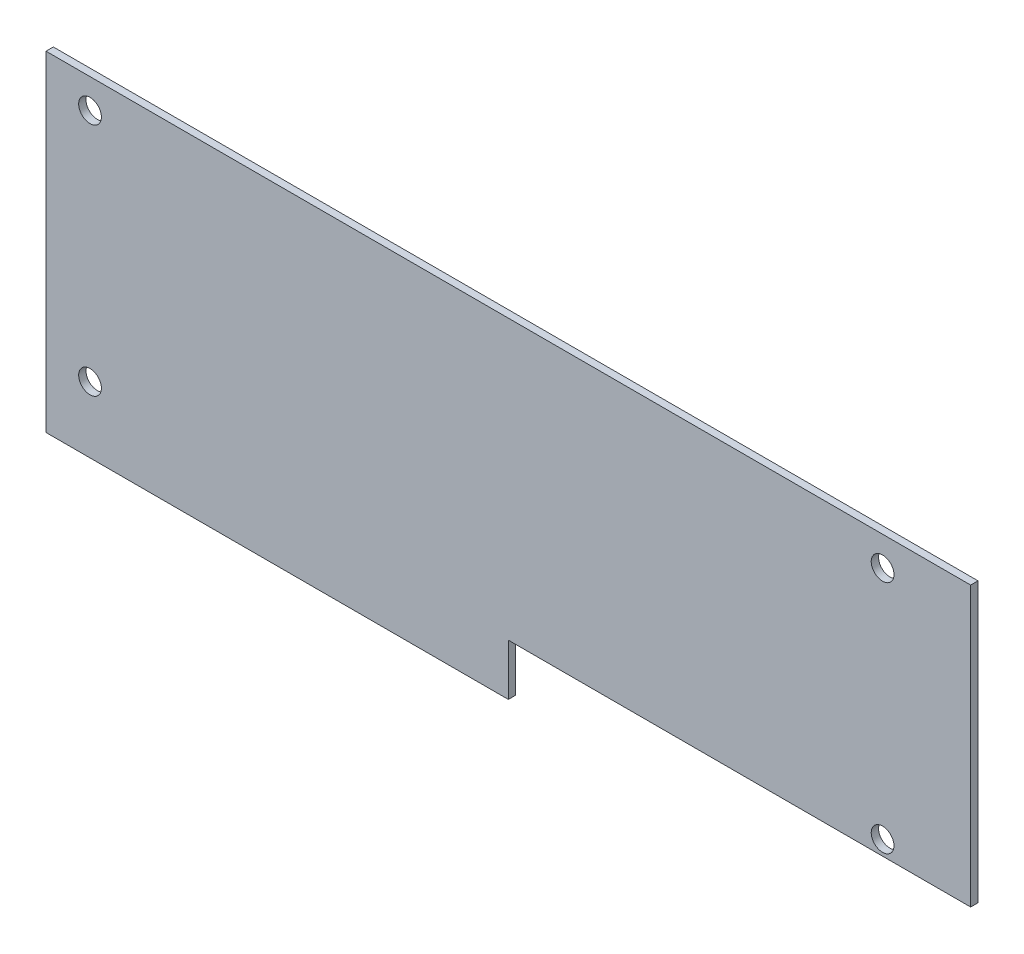
ISO-10303-21;
HEADER;
FILE_DESCRIPTION(('STEP AP214'),'2;1');
FILE_NAME('part.step','',(''),(''),'','','');
FILE_SCHEMA(('AUTOMOTIVE_DESIGN { 1 0 10303 214 1 1 1 1 }'));
ENDSEC;
DATA;
#1=APPLICATION_CONTEXT('core data for automotive mechanical design processes');
#2=APPLICATION_PROTOCOL_DEFINITION('international standard','automotive_design',2000,#1);
#3=PRODUCT_CONTEXT('',#1,'mechanical');
#4=PRODUCT('Part','Part','',(#3));
#5=PRODUCT_RELATED_PRODUCT_CATEGORY('part','',(#4));
#6=PRODUCT_DEFINITION_FORMATION('','',#4);
#7=PRODUCT_DEFINITION_CONTEXT('part definition',#1,'design');
#8=PRODUCT_DEFINITION('design','',#6,#7);
#9=PRODUCT_DEFINITION_SHAPE('','',#8);
#10=(LENGTH_UNIT() NAMED_UNIT(*) SI_UNIT(.MILLI.,.METRE.));
#11=(NAMED_UNIT(*) PLANE_ANGLE_UNIT() SI_UNIT($,.RADIAN.));
#12=(NAMED_UNIT(*) SI_UNIT($,.STERADIAN.) SOLID_ANGLE_UNIT());
#13=UNCERTAINTY_MEASURE_WITH_UNIT(LENGTH_MEASURE(1.E-05),#10,'distance_accuracy_value','');
#14=(GEOMETRIC_REPRESENTATION_CONTEXT(3) GLOBAL_UNCERTAINTY_ASSIGNED_CONTEXT((#13)) GLOBAL_UNIT_ASSIGNED_CONTEXT((#10,
#11,#12)) REPRESENTATION_CONTEXT('',''));
#15=CARTESIAN_POINT('',(0.,0.,0.));
#16=DIRECTION('',(0.,0.,1.));
#17=DIRECTION('',(1.,0.,0.));
#18=AXIS2_PLACEMENT_3D('',#15,#16,#17);
#19=CARTESIAN_POINT('',(-55.0506622714275,36.1882320296603,1.));
#20=DIRECTION('',(-1.,0.,0.));
#21=DIRECTION('',(0.,0.,1.));
#22=AXIS2_PLACEMENT_3D('',#19,#20,#21);
#23=PLANE('',#22);
#24=DIRECTION('',(0.,1.,0.));
#25=VECTOR('',#24,1.);
#26=CARTESIAN_POINT('',(-55.0506622714275,36.1882320296603,0.));
#27=LINE('',#26,#25);
#28=CARTESIAN_POINT('',(-55.0506622714275,36.1882320296603,0.));
#29=VERTEX_POINT('',#28);
#30=CARTESIAN_POINT('',(-55.0506622714275,43.1882320296603,0.));
#31=VERTEX_POINT('',#30);
#32=EDGE_CURVE('E134',#29,#31,#27,.T.);
#33=ORIENTED_EDGE('',*,*,#32,.T.);
#34=DIRECTION('',(0.,0.,-1.));
#35=VECTOR('',#34,1.);
#36=CARTESIAN_POINT('',(-55.0506622714275,43.1882320296603,1.));
#37=LINE('',#36,#35);
#38=CARTESIAN_POINT('',(-55.0506622714275,43.1882320296603,1.));
#39=VERTEX_POINT('',#38);
#40=EDGE_CURVE('E11',#39,#31,#37,.T.);
#41=ORIENTED_EDGE('',*,*,#40,.F.);
#42=DIRECTION('',(0.,1.,0.));
#43=VECTOR('',#42,1.);
#44=CARTESIAN_POINT('',(-55.0506622714275,36.1882320296603,1.));
#45=LINE('',#44,#43);
#46=CARTESIAN_POINT('',(-55.0506622714275,36.1882320296603,1.));
#47=VERTEX_POINT('',#46);
#48=EDGE_CURVE('E150',#47,#39,#45,.T.);
#49=ORIENTED_EDGE('',*,*,#48,.F.);
#50=DIRECTION('',(0.,0.,-1.));
#51=VECTOR('',#50,1.);
#52=CARTESIAN_POINT('',(-55.0506622714275,36.1882320296603,1.));
#53=LINE('',#52,#51);
#54=EDGE_CURVE('E130',#47,#29,#53,.T.);
#55=ORIENTED_EDGE('',*,*,#54,.T.);
#56=EDGE_LOOP('',(#33,#41,#49,#55));
#57=FACE_BOUND('',#56,.T.);
#58=ADVANCED_FACE('F39',(#57),#23,.F.);
#59=CARTESIAN_POINT('',(-55.0506622714275,43.1882320296603,1.));
#60=DIRECTION('',(0.,1.,0.));
#61=DIRECTION('',(-1.,0.,0.));
#62=AXIS2_PLACEMENT_3D('',#59,#60,#61);
#63=PLANE('',#62);
#64=DIRECTION('',(1.,0.,0.));
#65=VECTOR('',#64,1.);
#66=CARTESIAN_POINT('',(-55.0506622714275,43.1882320296603,0.));
#67=LINE('',#66,#65);
#68=CARTESIAN_POINT('',(7.94933772857251,43.1882320296603,0.));
#69=VERTEX_POINT('',#68);
#70=EDGE_CURVE('E138',#31,#69,#67,.T.);
#71=ORIENTED_EDGE('',*,*,#70,.T.);
#72=DIRECTION('',(0.,0.,-1.));
#73=VECTOR('',#72,1.);
#74=CARTESIAN_POINT('',(7.94933772857251,43.1882320296603,1.));
#75=LINE('',#74,#73);
#76=CARTESIAN_POINT('',(7.94933772857251,43.1882320296603,1.));
#77=VERTEX_POINT('',#76);
#78=EDGE_CURVE('E49',#77,#69,#75,.T.);
#79=ORIENTED_EDGE('',*,*,#78,.F.);
#80=DIRECTION('',(1.,0.,0.));
#81=VECTOR('',#80,1.);
#82=CARTESIAN_POINT('',(-55.0506622714275,43.1882320296603,1.));
#83=LINE('',#82,#81);
#84=EDGE_CURVE('E100',#39,#77,#83,.T.);
#85=ORIENTED_EDGE('',*,*,#84,.F.);
#86=ORIENTED_EDGE('',*,*,#40,.T.);
#87=EDGE_LOOP('',(#71,#79,#85,#86));
#88=FACE_BOUND('',#87,.T.);
#89=ADVANCED_FACE('F219',(#88),#63,.F.);
#90=CARTESIAN_POINT('',(7.94933772857251,81.1882320296603,1.));
#91=DIRECTION('',(-1.,0.,0.));
#92=DIRECTION('',(0.,0.,1.));
#93=AXIS2_PLACEMENT_3D('',#90,#91,#92);
#94=PLANE('',#93);
#95=DIRECTION('',(0.,1.,0.));
#96=VECTOR('',#95,1.);
#97=CARTESIAN_POINT('',(7.94933772857251,81.1882320296603,0.));
#98=LINE('',#97,#96);
#99=CARTESIAN_POINT('',(7.94933772857251,81.1882320296603,0.));
#100=VERTEX_POINT('',#99);
#101=EDGE_CURVE('E142',#69,#100,#98,.T.);
#102=ORIENTED_EDGE('',*,*,#101,.T.);
#103=DIRECTION('',(0.,0.,-1.));
#104=VECTOR('',#103,1.);
#105=CARTESIAN_POINT('',(7.94933772857251,81.1882320296603,1.));
#106=LINE('',#105,#104);
#107=CARTESIAN_POINT('',(7.94933772857251,81.1882320296603,1.));
#108=VERTEX_POINT('',#107);
#109=EDGE_CURVE('E124',#108,#100,#106,.T.);
#110=ORIENTED_EDGE('',*,*,#109,.F.);
#111=DIRECTION('',(0.,1.,0.));
#112=VECTOR('',#111,1.);
#113=CARTESIAN_POINT('',(7.94933772857251,81.1882320296603,1.));
#114=LINE('',#113,#112);
#115=EDGE_CURVE('E114',#77,#108,#114,.T.);
#116=ORIENTED_EDGE('',*,*,#115,.F.);
#117=ORIENTED_EDGE('',*,*,#78,.T.);
#118=EDGE_LOOP('',(#102,#110,#116,#117));
#119=FACE_BOUND('',#118,.T.);
#120=ADVANCED_FACE('F224',(#119),#94,.F.);
#121=CARTESIAN_POINT('',(-118.050662271427,81.1882320296603,1.));
#122=DIRECTION('',(0.,-1.,0.));
#123=DIRECTION('',(1.,0.,0.));
#124=AXIS2_PLACEMENT_3D('',#121,#122,#123);
#125=PLANE('',#124);
#126=DIRECTION('',(-1.,0.,0.));
#127=VECTOR('',#126,1.);
#128=CARTESIAN_POINT('',(-118.050662271427,81.1882320296603,0.));
#129=LINE('',#128,#127);
#130=CARTESIAN_POINT('',(-118.050662271427,81.1882320296603,0.));
#131=VERTEX_POINT('',#130);
#132=EDGE_CURVE('E123',#100,#131,#129,.T.);
#133=ORIENTED_EDGE('',*,*,#132,.T.);
#134=DIRECTION('',(0.,0.,-1.));
#135=VECTOR('',#134,1.);
#136=CARTESIAN_POINT('',(-118.050662271427,81.1882320296603,1.));
#137=LINE('',#136,#135);
#138=CARTESIAN_POINT('',(-118.050662271427,81.1882320296603,1.));
#139=VERTEX_POINT('',#138);
#140=EDGE_CURVE('E120',#139,#131,#137,.T.);
#141=ORIENTED_EDGE('',*,*,#140,.F.);
#142=DIRECTION('',(-1.,0.,0.));
#143=VECTOR('',#142,1.);
#144=CARTESIAN_POINT('',(-118.050662271427,81.1882320296603,1.));
#145=LINE('',#144,#143);
#146=EDGE_CURVE('E108',#108,#139,#145,.T.);
#147=ORIENTED_EDGE('',*,*,#146,.F.);
#148=ORIENTED_EDGE('',*,*,#109,.T.);
#149=EDGE_LOOP('',(#133,#141,#147,#148));
#150=FACE_BOUND('',#149,.T.);
#151=ADVANCED_FACE('F121',(#150),#125,.F.);
#152=CARTESIAN_POINT('',(-118.050662271427,36.1882320296603,1.));
#153=DIRECTION('',(1.,0.,0.));
#154=DIRECTION('',(0.,0.,-1.));
#155=AXIS2_PLACEMENT_3D('',#152,#153,#154);
#156=PLANE('',#155);
#157=DIRECTION('',(0.,-1.,0.));
#158=VECTOR('',#157,1.);
#159=CARTESIAN_POINT('',(-118.050662271427,36.1882320296603,0.));
#160=LINE('',#159,#158);
#161=CARTESIAN_POINT('',(-118.050662271427,36.1882320296603,0.));
#162=VERTEX_POINT('',#161);
#163=EDGE_CURVE('E85',#131,#162,#160,.T.);
#164=ORIENTED_EDGE('',*,*,#163,.T.);
#165=DIRECTION('',(0.,0.,-1.));
#166=VECTOR('',#165,1.);
#167=CARTESIAN_POINT('',(-118.050662271427,36.1882320296603,1.));
#168=LINE('',#167,#166);
#169=CARTESIAN_POINT('',(-118.050662271427,36.1882320296603,1.));
#170=VERTEX_POINT('',#169);
#171=EDGE_CURVE('E125',#170,#162,#168,.T.);
#172=ORIENTED_EDGE('',*,*,#171,.F.);
#173=DIRECTION('',(0.,-1.,0.));
#174=VECTOR('',#173,1.);
#175=CARTESIAN_POINT('',(-118.050662271427,36.1882320296603,1.));
#176=LINE('',#175,#174);
#177=EDGE_CURVE('E112',#139,#170,#176,.T.);
#178=ORIENTED_EDGE('',*,*,#177,.F.);
#179=ORIENTED_EDGE('',*,*,#140,.T.);
#180=EDGE_LOOP('',(#164,#172,#178,#179));
#181=FACE_BOUND('',#180,.T.);
#182=ADVANCED_FACE('F127',(#181),#156,.F.);
#183=CARTESIAN_POINT('',(-118.050662271427,36.1882320296603,1.));
#184=DIRECTION('',(0.,1.,0.));
#185=DIRECTION('',(0.,0.,1.));
#186=AXIS2_PLACEMENT_3D('',#183,#184,#185);
#187=PLANE('',#186);
#188=DIRECTION('',(1.,0.,0.));
#189=VECTOR('',#188,1.);
#190=CARTESIAN_POINT('',(-118.050662271427,36.1882320296603,0.));
#191=LINE('',#190,#189);
#192=EDGE_CURVE('E92',#162,#29,#191,.T.);
#193=ORIENTED_EDGE('',*,*,#192,.T.);
#194=ORIENTED_EDGE('',*,*,#54,.F.);
#195=DIRECTION('',(1.,0.,0.));
#196=VECTOR('',#195,1.);
#197=CARTESIAN_POINT('',(-118.050662271427,36.1882320296603,1.));
#198=LINE('',#197,#196);
#199=EDGE_CURVE('E61',#170,#47,#198,.T.);
#200=ORIENTED_EDGE('',*,*,#199,.F.);
#201=ORIENTED_EDGE('',*,*,#171,.T.);
#202=EDGE_LOOP('',(#193,#194,#200,#201));
#203=FACE_BOUND('',#202,.T.);
#204=ADVANCED_FACE('F197',(#203),#187,.F.);
#205=CARTESIAN_POINT('',(0.,0.,1.));
#206=DIRECTION('',(0.,0.,-1.));
#207=DIRECTION('',(-1.,0.,0.));
#208=AXIS2_PLACEMENT_3D('',#205,#206,#207);
#209=PLANE('',#208);
#210=CARTESIAN_POINT('',(-4.05066227142764,45.1882320296601,1.));
#211=DIRECTION('',(0.,0.,1.));
#212=DIRECTION('',(1.,0.,0.));
#213=AXIS2_PLACEMENT_3D('',#210,#211,#212);
#214=CIRCLE('',#213,1.55);
#215=CARTESIAN_POINT('',(-2.50066227142764,45.1882320296601,1.));
#216=VERTEX_POINT('',#215);
#217=EDGE_CURVE('E179',#216,#216,#214,.T.);
#218=ORIENTED_EDGE('',*,*,#217,.F.);
#219=EDGE_LOOP('',(#218));
#220=FACE_BOUND('',#219,.T.);
#221=CARTESIAN_POINT('',(-4.05066227142764,77.1882320296601,1.));
#222=DIRECTION('',(0.,0.,1.));
#223=DIRECTION('',(1.,0.,0.));
#224=AXIS2_PLACEMENT_3D('',#221,#222,#223);
#225=CIRCLE('',#224,1.54999999999999);
#226=CARTESIAN_POINT('',(-2.50066227142765,77.1882320296601,1.));
#227=VERTEX_POINT('',#226);
#228=EDGE_CURVE('E167',#227,#227,#225,.T.);
#229=ORIENTED_EDGE('',*,*,#228,.F.);
#230=EDGE_LOOP('',(#229));
#231=FACE_BOUND('',#230,.T.);
#232=CARTESIAN_POINT('',(-112.050662271428,45.1882320296601,1.));
#233=DIRECTION('',(0.,0.,1.));
#234=DIRECTION('',(1.,0.,0.));
#235=AXIS2_PLACEMENT_3D('',#232,#233,#234);
#236=CIRCLE('',#235,1.54999999999999);
#237=CARTESIAN_POINT('',(-110.500662271428,45.1882320296601,1.));
#238=VERTEX_POINT('',#237);
#239=EDGE_CURVE('E163',#238,#238,#236,.T.);
#240=ORIENTED_EDGE('',*,*,#239,.F.);
#241=EDGE_LOOP('',(#240));
#242=FACE_BOUND('',#241,.T.);
#243=CARTESIAN_POINT('',(-112.050662271428,77.1882320296601,1.));
#244=DIRECTION('',(0.,0.,1.));
#245=DIRECTION('',(1.,0.,0.));
#246=AXIS2_PLACEMENT_3D('',#243,#244,#245);
#247=CIRCLE('',#246,1.54999999999999);
#248=CARTESIAN_POINT('',(-110.500662271428,77.1882320296601,1.));
#249=VERTEX_POINT('',#248);
#250=EDGE_CURVE('E160',#249,#249,#247,.T.);
#251=ORIENTED_EDGE('',*,*,#250,.F.);
#252=EDGE_LOOP('',(#251));
#253=FACE_BOUND('',#252,.T.);
#254=ORIENTED_EDGE('',*,*,#48,.T.);
#255=ORIENTED_EDGE('',*,*,#84,.T.);
#256=ORIENTED_EDGE('',*,*,#115,.T.);
#257=ORIENTED_EDGE('',*,*,#146,.T.);
#258=ORIENTED_EDGE('',*,*,#177,.T.);
#259=ORIENTED_EDGE('',*,*,#199,.T.);
#260=EDGE_LOOP('',(#254,#255,#256,#257,#258,#259));
#261=FACE_BOUND('',#260,.T.);
#262=ADVANCED_FACE('F110',(#220,#231,#242,#253,#261),#209,.F.);
#263=CARTESIAN_POINT('',(0.,0.,0.));
#264=DIRECTION('',(0.,0.,-1.));
#265=DIRECTION('',(-1.,0.,0.));
#266=AXIS2_PLACEMENT_3D('',#263,#264,#265);
#267=PLANE('',#266);
#268=CARTESIAN_POINT('',(-4.05066227142764,45.1882320296601,0.));
#269=DIRECTION('',(0.,0.,-1.));
#270=DIRECTION('',(-1.,0.,0.));
#271=AXIS2_PLACEMENT_3D('',#268,#269,#270);
#272=CIRCLE('',#271,1.55);
#273=CARTESIAN_POINT('',(-5.60066227142765,45.1882320296601,0.));
#274=VERTEX_POINT('',#273);
#275=EDGE_CURVE('E42',#274,#274,#272,.T.);
#276=ORIENTED_EDGE('',*,*,#275,.F.);
#277=EDGE_LOOP('',(#276));
#278=FACE_BOUND('',#277,.T.);
#279=CARTESIAN_POINT('',(-4.05066227142764,77.1882320296601,0.));
#280=DIRECTION('',(0.,0.,-1.));
#281=DIRECTION('',(-1.,0.,0.));
#282=AXIS2_PLACEMENT_3D('',#279,#280,#281);
#283=CIRCLE('',#282,1.54999999999999);
#284=CARTESIAN_POINT('',(-5.60066227142763,77.1882320296601,0.));
#285=VERTEX_POINT('',#284);
#286=EDGE_CURVE('E164',#285,#285,#283,.T.);
#287=ORIENTED_EDGE('',*,*,#286,.F.);
#288=EDGE_LOOP('',(#287));
#289=FACE_BOUND('',#288,.T.);
#290=CARTESIAN_POINT('',(-112.050662271428,45.1882320296601,0.));
#291=DIRECTION('',(0.,0.,-1.));
#292=DIRECTION('',(-1.,0.,0.));
#293=AXIS2_PLACEMENT_3D('',#290,#291,#292);
#294=CIRCLE('',#293,1.54999999999999);
#295=CARTESIAN_POINT('',(-113.600662271428,45.1882320296601,0.));
#296=VERTEX_POINT('',#295);
#297=EDGE_CURVE('E161',#296,#296,#294,.T.);
#298=ORIENTED_EDGE('',*,*,#297,.F.);
#299=EDGE_LOOP('',(#298));
#300=FACE_BOUND('',#299,.T.);
#301=CARTESIAN_POINT('',(-112.050662271428,77.1882320296601,0.));
#302=DIRECTION('',(0.,0.,-1.));
#303=DIRECTION('',(-1.,0.,0.));
#304=AXIS2_PLACEMENT_3D('',#301,#302,#303);
#305=CIRCLE('',#304,1.54999999999999);
#306=CARTESIAN_POINT('',(-113.600662271428,77.1882320296601,0.));
#307=VERTEX_POINT('',#306);
#308=EDGE_CURVE('E139',#307,#307,#305,.T.);
#309=ORIENTED_EDGE('',*,*,#308,.F.);
#310=EDGE_LOOP('',(#309));
#311=FACE_BOUND('',#310,.T.);
#312=ORIENTED_EDGE('',*,*,#32,.F.);
#313=ORIENTED_EDGE('',*,*,#192,.F.);
#314=ORIENTED_EDGE('',*,*,#163,.F.);
#315=ORIENTED_EDGE('',*,*,#132,.F.);
#316=ORIENTED_EDGE('',*,*,#101,.F.);
#317=ORIENTED_EDGE('',*,*,#70,.F.);
#318=EDGE_LOOP('',(#312,#313,#314,#315,#316,#317));
#319=FACE_BOUND('',#318,.T.);
#320=ADVANCED_FACE('F196',(#278,#289,#300,#311,#319),#267,.T.);
#321=CARTESIAN_POINT('',(-112.050662271428,77.1882320296601,-9.));
#322=DIRECTION('',(0.,0.,1.));
#323=DIRECTION('',(1.,0.,0.));
#324=AXIS2_PLACEMENT_3D('',#321,#322,#323);
#325=CYLINDRICAL_SURFACE('',#324,1.54999999999999);
#326=ORIENTED_EDGE('',*,*,#308,.T.);
#327=EDGE_LOOP('',(#326));
#328=FACE_BOUND('',#327,.T.);
#329=ORIENTED_EDGE('',*,*,#250,.T.);
#330=EDGE_LOOP('',(#329));
#331=FACE_BOUND('',#330,.T.);
#332=ADVANCED_FACE('F204',(#328,#331),#325,.F.);
#333=CARTESIAN_POINT('',(-112.050662271428,45.1882320296601,-9.));
#334=DIRECTION('',(0.,0.,1.));
#335=DIRECTION('',(1.,0.,0.));
#336=AXIS2_PLACEMENT_3D('',#333,#334,#335);
#337=CYLINDRICAL_SURFACE('',#336,1.54999999999999);
#338=ORIENTED_EDGE('',*,*,#297,.T.);
#339=EDGE_LOOP('',(#338));
#340=FACE_BOUND('',#339,.T.);
#341=ORIENTED_EDGE('',*,*,#239,.T.);
#342=EDGE_LOOP('',(#341));
#343=FACE_BOUND('',#342,.T.);
#344=ADVANCED_FACE('F206',(#340,#343),#337,.F.);
#345=CARTESIAN_POINT('',(-4.05066227142764,77.1882320296601,-9.));
#346=DIRECTION('',(0.,0.,1.));
#347=DIRECTION('',(1.,0.,0.));
#348=AXIS2_PLACEMENT_3D('',#345,#346,#347);
#349=CYLINDRICAL_SURFACE('',#348,1.54999999999999);
#350=ORIENTED_EDGE('',*,*,#286,.T.);
#351=EDGE_LOOP('',(#350));
#352=FACE_BOUND('',#351,.T.);
#353=ORIENTED_EDGE('',*,*,#228,.T.);
#354=EDGE_LOOP('',(#353));
#355=FACE_BOUND('',#354,.T.);
#356=ADVANCED_FACE('F213',(#352,#355),#349,.F.);
#357=CARTESIAN_POINT('',(-4.05066227142764,45.1882320296601,-9.));
#358=DIRECTION('',(0.,0.,1.));
#359=DIRECTION('',(1.,0.,0.));
#360=AXIS2_PLACEMENT_3D('',#357,#358,#359);
#361=CYLINDRICAL_SURFACE('',#360,1.55);
#362=ORIENTED_EDGE('',*,*,#275,.T.);
#363=EDGE_LOOP('',(#362));
#364=FACE_BOUND('',#363,.T.);
#365=ORIENTED_EDGE('',*,*,#217,.T.);
#366=EDGE_LOOP('',(#365));
#367=FACE_BOUND('',#366,.T.);
#368=ADVANCED_FACE('F192',(#364,#367),#361,.F.);
#369=CLOSED_SHELL('',(#58,#89,#120,#151,#182,#204,#262,#320,#332,#344,#356,#368));
#370=MANIFOLD_SOLID_BREP('B2',#369);
#371=ADVANCED_BREP_SHAPE_REPRESENTATION('',(#18,#370),#14);
#372=SHAPE_DEFINITION_REPRESENTATION(#9,#371);
ENDSEC;
END-ISO-10303-21;
